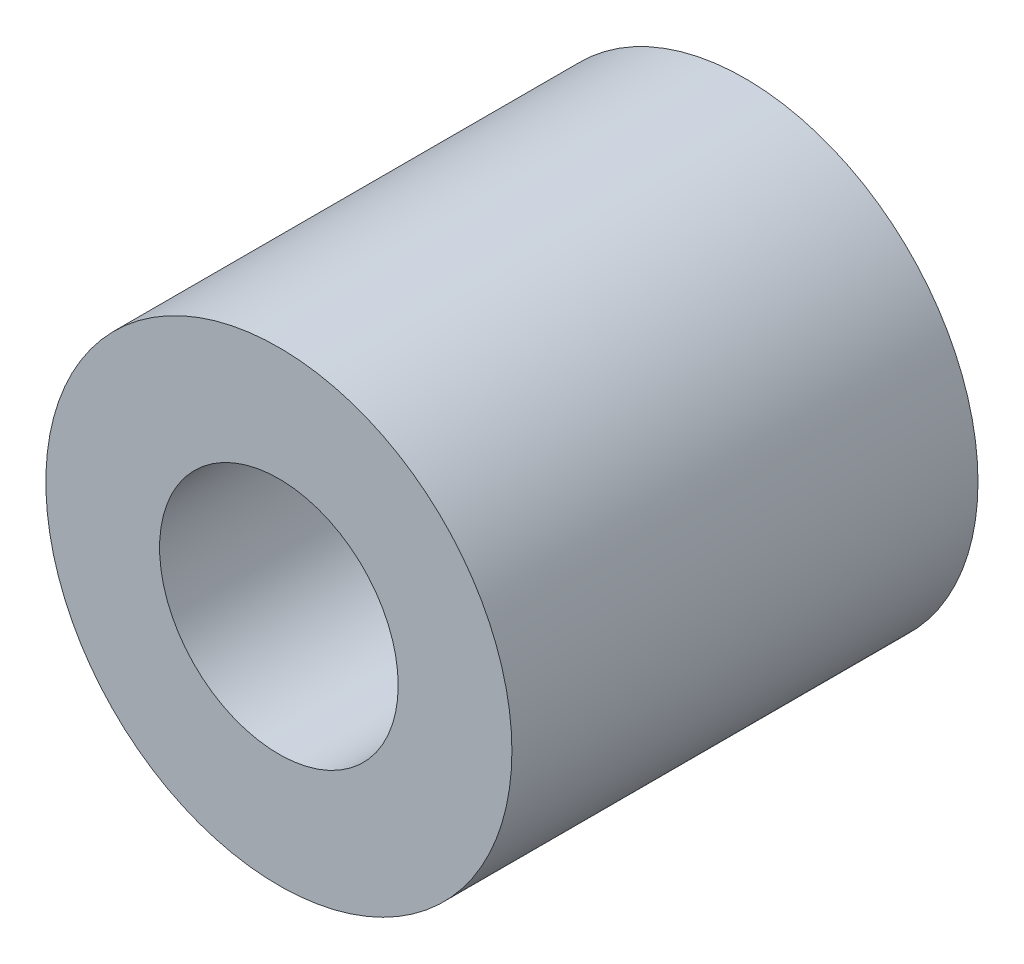
ISO-10303-21;
HEADER;
FILE_DESCRIPTION(('STEP AP214'),'2;1');
FILE_NAME('part.step','',(''),(''),'','','');
FILE_SCHEMA(('AUTOMOTIVE_DESIGN { 1 0 10303 214 1 1 1 1 }'));
ENDSEC;
DATA;
#1=APPLICATION_CONTEXT('core data for automotive mechanical design processes');
#2=APPLICATION_PROTOCOL_DEFINITION('international standard','automotive_design',2000,#1);
#3=PRODUCT_CONTEXT('',#1,'mechanical');
#4=PRODUCT('Part','Part','',(#3));
#5=PRODUCT_RELATED_PRODUCT_CATEGORY('part','',(#4));
#6=PRODUCT_DEFINITION_FORMATION('','',#4);
#7=PRODUCT_DEFINITION_CONTEXT('part definition',#1,'design');
#8=PRODUCT_DEFINITION('design','',#6,#7);
#9=PRODUCT_DEFINITION_SHAPE('','',#8);
#10=(LENGTH_UNIT() NAMED_UNIT(*) SI_UNIT(.MILLI.,.METRE.));
#11=(NAMED_UNIT(*) PLANE_ANGLE_UNIT() SI_UNIT($,.RADIAN.));
#12=(NAMED_UNIT(*) SI_UNIT($,.STERADIAN.) SOLID_ANGLE_UNIT());
#13=UNCERTAINTY_MEASURE_WITH_UNIT(LENGTH_MEASURE(1.E-05),#10,'distance_accuracy_value','');
#14=(GEOMETRIC_REPRESENTATION_CONTEXT(3) GLOBAL_UNCERTAINTY_ASSIGNED_CONTEXT((#13)) GLOBAL_UNIT_ASSIGNED_CONTEXT((#10,
#11,#12)) REPRESENTATION_CONTEXT('',''));
#15=CARTESIAN_POINT('',(0.,0.,0.));
#16=DIRECTION('',(0.,0.,1.));
#17=DIRECTION('',(1.,0.,0.));
#18=AXIS2_PLACEMENT_3D('',#15,#16,#17);
#19=CARTESIAN_POINT('',(0.,0.,1.5875));
#20=DIRECTION('',(0.,0.,1.));
#21=DIRECTION('',(1.,0.,0.));
#22=AXIS2_PLACEMENT_3D('',#19,#20,#21);
#23=PLANE('',#22);
#24=CARTESIAN_POINT('',(0.,0.,1.5875));
#25=DIRECTION('',(0.,0.,1.));
#26=DIRECTION('',(1.,0.,0.));
#27=AXIS2_PLACEMENT_3D('',#24,#25,#26);
#28=CIRCLE('',#27,1.5875);
#29=CARTESIAN_POINT('',(1.5875,0.,1.5875));
#30=VERTEX_POINT('',#29);
#31=EDGE_CURVE('E10',#30,#30,#28,.T.);
#32=ORIENTED_EDGE('',*,*,#31,.T.);
#33=EDGE_LOOP('',(#32));
#34=FACE_BOUND('',#33,.T.);
#35=CARTESIAN_POINT('',(0.,0.,1.5875));
#36=DIRECTION('',(0.,0.,1.));
#37=DIRECTION('',(1.,0.,0.));
#38=AXIS2_PLACEMENT_3D('',#35,#36,#37);
#39=CIRCLE('',#38,0.8128);
#40=CARTESIAN_POINT('',(0.8128,0.,1.5875));
#41=VERTEX_POINT('',#40);
#42=EDGE_CURVE('E41',#41,#41,#39,.T.);
#43=ORIENTED_EDGE('',*,*,#42,.F.);
#44=EDGE_LOOP('',(#43));
#45=FACE_BOUND('',#44,.T.);
#46=ADVANCED_FACE('F30',(#34,#45),#23,.T.);
#47=CARTESIAN_POINT('',(0.,0.,-1.5875));
#48=DIRECTION('',(0.,0.,1.));
#49=DIRECTION('',(1.,0.,0.));
#50=AXIS2_PLACEMENT_3D('',#47,#48,#49);
#51=PLANE('',#50);
#52=CARTESIAN_POINT('',(0.,0.,-1.5875));
#53=DIRECTION('',(0.,0.,1.));
#54=DIRECTION('',(1.,0.,0.));
#55=AXIS2_PLACEMENT_3D('',#52,#53,#54);
#56=CIRCLE('',#55,1.5875);
#57=CARTESIAN_POINT('',(1.5875,0.,-1.5875));
#58=VERTEX_POINT('',#57);
#59=EDGE_CURVE('E34',#58,#58,#56,.T.);
#60=ORIENTED_EDGE('',*,*,#59,.F.);
#61=EDGE_LOOP('',(#60));
#62=FACE_BOUND('',#61,.T.);
#63=CARTESIAN_POINT('',(0.,0.,-1.5875));
#64=DIRECTION('',(0.,0.,1.));
#65=DIRECTION('',(1.,0.,0.));
#66=AXIS2_PLACEMENT_3D('',#63,#64,#65);
#67=CIRCLE('',#66,0.8128);
#68=CARTESIAN_POINT('',(0.8128,0.,-1.5875));
#69=VERTEX_POINT('',#68);
#70=EDGE_CURVE('E43',#69,#69,#67,.T.);
#71=ORIENTED_EDGE('',*,*,#70,.T.);
#72=EDGE_LOOP('',(#71));
#73=FACE_BOUND('',#72,.T.);
#74=ADVANCED_FACE('F53',(#62,#73),#51,.F.);
#75=CARTESIAN_POINT('',(0.,0.,1.5875));
#76=DIRECTION('',(0.,0.,-1.));
#77=DIRECTION('',(-1.,0.,0.));
#78=AXIS2_PLACEMENT_3D('',#75,#76,#77);
#79=CYLINDRICAL_SURFACE('',#78,1.5875);
#80=ORIENTED_EDGE('',*,*,#31,.F.);
#81=EDGE_LOOP('',(#80));
#82=FACE_BOUND('',#81,.T.);
#83=ORIENTED_EDGE('',*,*,#59,.T.);
#84=EDGE_LOOP('',(#83));
#85=FACE_BOUND('',#84,.T.);
#86=ADVANCED_FACE('F32',(#82,#85),#79,.T.);
#87=CARTESIAN_POINT('',(0.,0.,1.5875));
#88=DIRECTION('',(0.,0.,-1.));
#89=DIRECTION('',(-1.,0.,0.));
#90=AXIS2_PLACEMENT_3D('',#87,#88,#89);
#91=CYLINDRICAL_SURFACE('',#90,0.8128);
#92=ORIENTED_EDGE('',*,*,#42,.T.);
#93=EDGE_LOOP('',(#92));
#94=FACE_BOUND('',#93,.T.);
#95=ORIENTED_EDGE('',*,*,#70,.F.);
#96=EDGE_LOOP('',(#95));
#97=FACE_BOUND('',#96,.T.);
#98=ADVANCED_FACE('F49',(#94,#97),#91,.F.);
#99=CLOSED_SHELL('',(#46,#74,#86,#98));
#100=MANIFOLD_SOLID_BREP('B2',#99);
#101=ADVANCED_BREP_SHAPE_REPRESENTATION('',(#18,#100),#14);
#102=SHAPE_DEFINITION_REPRESENTATION(#9,#101);
ENDSEC;
END-ISO-10303-21;
